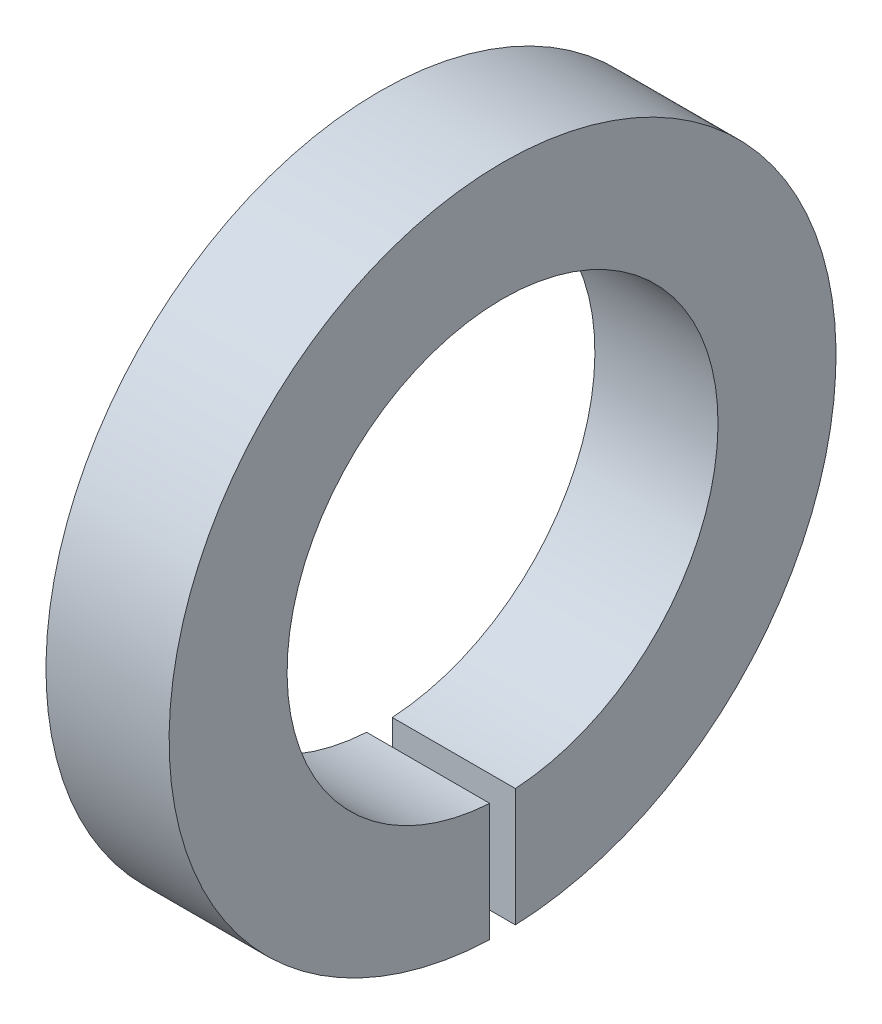
ISO-10303-21;
HEADER;
FILE_DESCRIPTION(('STEP AP214'),'2;1');
FILE_NAME('part.step','',(''),(''),'','','');
FILE_SCHEMA(('AUTOMOTIVE_DESIGN { 1 0 10303 214 1 1 1 1 }'));
ENDSEC;
DATA;
#1=APPLICATION_CONTEXT('core data for automotive mechanical design processes');
#2=APPLICATION_PROTOCOL_DEFINITION('international standard','automotive_design',2000,#1);
#3=PRODUCT_CONTEXT('',#1,'mechanical');
#4=PRODUCT('Part','Part','',(#3));
#5=PRODUCT_RELATED_PRODUCT_CATEGORY('part','',(#4));
#6=PRODUCT_DEFINITION_FORMATION('','',#4);
#7=PRODUCT_DEFINITION_CONTEXT('part definition',#1,'design');
#8=PRODUCT_DEFINITION('design','',#6,#7);
#9=PRODUCT_DEFINITION_SHAPE('','',#8);
#10=(LENGTH_UNIT() NAMED_UNIT(*) SI_UNIT(.MILLI.,.METRE.));
#11=(NAMED_UNIT(*) PLANE_ANGLE_UNIT() SI_UNIT($,.RADIAN.));
#12=(NAMED_UNIT(*) SI_UNIT($,.STERADIAN.) SOLID_ANGLE_UNIT());
#13=UNCERTAINTY_MEASURE_WITH_UNIT(LENGTH_MEASURE(1.E-05),#10,'distance_accuracy_value','');
#14=(GEOMETRIC_REPRESENTATION_CONTEXT(3) GLOBAL_UNCERTAINTY_ASSIGNED_CONTEXT((#13)) GLOBAL_UNIT_ASSIGNED_CONTEXT((#10,
#11,#12)) REPRESENTATION_CONTEXT('',''));
#15=CARTESIAN_POINT('',(0.,0.,0.));
#16=DIRECTION('',(0.,0.,1.));
#17=DIRECTION('',(1.,0.,0.));
#18=AXIS2_PLACEMENT_3D('',#15,#16,#17);
#19=CARTESIAN_POINT('',(1.2,0.,0.));
#20=DIRECTION('',(-1.,0.,0.));
#21=DIRECTION('',(0.,0.,1.));
#22=AXIS2_PLACEMENT_3D('',#19,#20,#21);
#23=CYLINDRICAL_SURFACE('',#22,2.1);
#24=CARTESIAN_POINT('',(1.2,0.,0.));
#25=DIRECTION('',(1.,0.,0.));
#26=DIRECTION('',(0.,0.,-1.));
#27=AXIS2_PLACEMENT_3D('',#24,#25,#26);
#28=CIRCLE('',#27,2.1);
#29=CARTESIAN_POINT('',(1.2,-2.09627646077515,-0.125));
#30=VERTEX_POINT('',#29);
#31=CARTESIAN_POINT('',(1.2,-2.09627646077515,0.125));
#32=VERTEX_POINT('',#31);
#33=EDGE_CURVE('E91',#30,#32,#28,.T.);
#34=ORIENTED_EDGE('',*,*,#33,.T.);
#35=DIRECTION('',(-1.,0.,0.));
#36=VECTOR('',#35,1.);
#37=CARTESIAN_POINT('',(1.2,-2.09627646077515,0.125));
#38=LINE('',#37,#36);
#39=CARTESIAN_POINT('',(0.,-2.09627646077515,0.125));
#40=VERTEX_POINT('',#39);
#41=EDGE_CURVE('E77',#32,#40,#38,.T.);
#42=ORIENTED_EDGE('',*,*,#41,.T.);
#43=CARTESIAN_POINT('',(0.,0.,0.));
#44=DIRECTION('',(1.,0.,0.));
#45=DIRECTION('',(0.,0.,-1.));
#46=AXIS2_PLACEMENT_3D('',#43,#44,#45);
#47=CIRCLE('',#46,2.1);
#48=CARTESIAN_POINT('',(0.,-2.09627646077515,-0.125));
#49=VERTEX_POINT('',#48);
#50=EDGE_CURVE('E82',#49,#40,#47,.T.);
#51=ORIENTED_EDGE('',*,*,#50,.F.);
#52=DIRECTION('',(-1.,0.,0.));
#53=VECTOR('',#52,1.);
#54=CARTESIAN_POINT('',(1.2,-2.09627646077515,-0.125));
#55=LINE('',#54,#53);
#56=EDGE_CURVE('E94',#30,#49,#55,.T.);
#57=ORIENTED_EDGE('',*,*,#56,.F.);
#58=EDGE_LOOP('',(#34,#42,#51,#57));
#59=FACE_BOUND('',#58,.T.);
#60=ADVANCED_FACE('F36',(#59),#23,.F.);
#61=CARTESIAN_POINT('',(1.2,0.,0.));
#62=DIRECTION('',(1.,0.,0.));
#63=DIRECTION('',(0.,0.,-1.));
#64=AXIS2_PLACEMENT_3D('',#61,#62,#63);
#65=PLANE('',#64);
#66=DIRECTION('',(0.,-1.,0.));
#67=VECTOR('',#66,1.);
#68=CARTESIAN_POINT('',(1.2,-2.09627646077515,0.125));
#69=LINE('',#68,#67);
#70=CARTESIAN_POINT('',(1.2,-3.24759526419165,0.125000000000001));
#71=VERTEX_POINT('',#70);
#72=EDGE_CURVE('E79',#32,#71,#69,.T.);
#73=ORIENTED_EDGE('',*,*,#72,.F.);
#74=ORIENTED_EDGE('',*,*,#33,.F.);
#75=DIRECTION('',(0.,1.,0.));
#76=VECTOR('',#75,1.);
#77=CARTESIAN_POINT('',(1.2,-2.09627646077515,-0.125));
#78=LINE('',#77,#76);
#79=CARTESIAN_POINT('',(1.2,-3.24759526419165,-0.125));
#80=VERTEX_POINT('',#79);
#81=EDGE_CURVE('E64',#80,#30,#78,.T.);
#82=ORIENTED_EDGE('',*,*,#81,.F.);
#83=CARTESIAN_POINT('',(1.2,0.,0.));
#84=DIRECTION('',(1.,0.,0.));
#85=DIRECTION('',(0.,0.,-1.));
#86=AXIS2_PLACEMENT_3D('',#83,#84,#85);
#87=CIRCLE('',#86,3.25);
#88=EDGE_CURVE('E11',#80,#71,#87,.T.);
#89=ORIENTED_EDGE('',*,*,#88,.T.);
#90=EDGE_LOOP('',(#73,#74,#82,#89));
#91=FACE_BOUND('',#90,.T.);
#92=ADVANCED_FACE('F89',(#91),#65,.T.);
#93=CARTESIAN_POINT('',(0.,0.,0.));
#94=DIRECTION('',(1.,0.,0.));
#95=DIRECTION('',(0.,0.,-1.));
#96=AXIS2_PLACEMENT_3D('',#93,#94,#95);
#97=PLANE('',#96);
#98=CARTESIAN_POINT('',(0.,0.,0.));
#99=DIRECTION('',(1.,0.,0.));
#100=DIRECTION('',(0.,0.,-1.));
#101=AXIS2_PLACEMENT_3D('',#98,#99,#100);
#102=CIRCLE('',#101,3.25);
#103=CARTESIAN_POINT('',(0.,-3.24759526419165,-0.125));
#104=VERTEX_POINT('',#103);
#105=CARTESIAN_POINT('',(0.,-3.24759526419165,0.125000000000001));
#106=VERTEX_POINT('',#105);
#107=EDGE_CURVE('E45',#104,#106,#102,.T.);
#108=ORIENTED_EDGE('',*,*,#107,.F.);
#109=DIRECTION('',(0.,1.,0.));
#110=VECTOR('',#109,1.);
#111=CARTESIAN_POINT('',(0.,-2.09627646077515,-0.125));
#112=LINE('',#111,#110);
#113=EDGE_CURVE('E93',#104,#49,#112,.T.);
#114=ORIENTED_EDGE('',*,*,#113,.T.);
#115=ORIENTED_EDGE('',*,*,#50,.T.);
#116=DIRECTION('',(0.,-1.,0.));
#117=VECTOR('',#116,1.);
#118=CARTESIAN_POINT('',(0.,-2.09627646077515,0.125));
#119=LINE('',#118,#117);
#120=EDGE_CURVE('E52',#40,#106,#119,.T.);
#121=ORIENTED_EDGE('',*,*,#120,.T.);
#122=EDGE_LOOP('',(#108,#114,#115,#121));
#123=FACE_BOUND('',#122,.T.);
#124=ADVANCED_FACE('F109',(#123),#97,.F.);
#125=CARTESIAN_POINT('',(1.2,0.,0.));
#126=DIRECTION('',(-1.,0.,0.));
#127=DIRECTION('',(0.,0.,1.));
#128=AXIS2_PLACEMENT_3D('',#125,#126,#127);
#129=CYLINDRICAL_SURFACE('',#128,3.25);
#130=ORIENTED_EDGE('',*,*,#88,.F.);
#131=DIRECTION('',(-1.,0.,0.));
#132=VECTOR('',#131,1.);
#133=CARTESIAN_POINT('',(1.2,-3.24759526419165,-0.125));
#134=LINE('',#133,#132);
#135=EDGE_CURVE('E103',#80,#104,#134,.T.);
#136=ORIENTED_EDGE('',*,*,#135,.T.);
#137=ORIENTED_EDGE('',*,*,#107,.T.);
#138=DIRECTION('',(-1.,0.,0.));
#139=VECTOR('',#138,1.);
#140=CARTESIAN_POINT('',(1.2,-3.24759526419165,0.125000000000001));
#141=LINE('',#140,#139);
#142=EDGE_CURVE('E86',#71,#106,#141,.T.);
#143=ORIENTED_EDGE('',*,*,#142,.F.);
#144=EDGE_LOOP('',(#130,#136,#137,#143));
#145=FACE_BOUND('',#144,.T.);
#146=ADVANCED_FACE('F37',(#145),#129,.T.);
#147=CARTESIAN_POINT('',(1.2,-2.09627646077515,-0.125));
#148=DIRECTION('',(0.,0.,1.));
#149=DIRECTION('',(1.,0.,0.));
#150=AXIS2_PLACEMENT_3D('',#147,#148,#149);
#151=PLANE('',#150);
#152=ORIENTED_EDGE('',*,*,#113,.F.);
#153=ORIENTED_EDGE('',*,*,#135,.F.);
#154=ORIENTED_EDGE('',*,*,#81,.T.);
#155=ORIENTED_EDGE('',*,*,#56,.T.);
#156=EDGE_LOOP('',(#152,#153,#154,#155));
#157=FACE_BOUND('',#156,.T.);
#158=ADVANCED_FACE('F115',(#157),#151,.T.);
#159=CARTESIAN_POINT('',(1.2,-2.09627646077515,0.125));
#160=DIRECTION('',(0.,0.,-1.));
#161=DIRECTION('',(-1.,0.,0.));
#162=AXIS2_PLACEMENT_3D('',#159,#160,#161);
#163=PLANE('',#162);
#164=ORIENTED_EDGE('',*,*,#120,.F.);
#165=ORIENTED_EDGE('',*,*,#41,.F.);
#166=ORIENTED_EDGE('',*,*,#72,.T.);
#167=ORIENTED_EDGE('',*,*,#142,.T.);
#168=EDGE_LOOP('',(#164,#165,#166,#167));
#169=FACE_BOUND('',#168,.T.);
#170=ADVANCED_FACE('F76',(#169),#163,.T.);
#171=CLOSED_SHELL('',(#60,#92,#124,#146,#158,#170));
#172=MANIFOLD_SOLID_BREP('B2',#171);
#173=ADVANCED_BREP_SHAPE_REPRESENTATION('',(#18,#172),#14);
#174=SHAPE_DEFINITION_REPRESENTATION(#9,#173);
ENDSEC;
END-ISO-10303-21;
